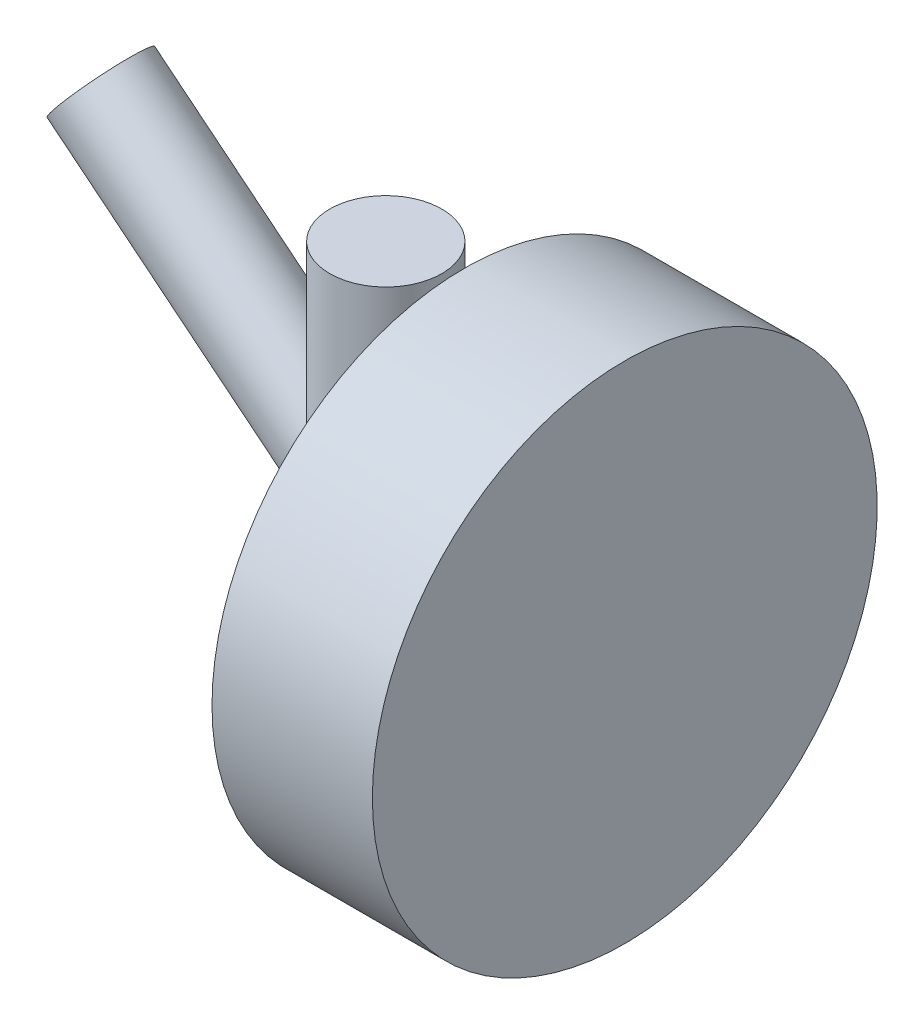
ISO-10303-21;
HEADER;
FILE_DESCRIPTION(('STEP AP214'),'2;1');
FILE_NAME('part.step','',(''),(''),'','','');
FILE_SCHEMA(('AUTOMOTIVE_DESIGN { 1 0 10303 214 1 1 1 1 }'));
ENDSEC;
DATA;
#1=APPLICATION_CONTEXT('core data for automotive mechanical design processes');
#2=APPLICATION_PROTOCOL_DEFINITION('international standard','automotive_design',2000,#1);
#3=PRODUCT_CONTEXT('',#1,'mechanical');
#4=PRODUCT('Part','Part','',(#3));
#5=PRODUCT_RELATED_PRODUCT_CATEGORY('part','',(#4));
#6=PRODUCT_DEFINITION_FORMATION('','',#4);
#7=PRODUCT_DEFINITION_CONTEXT('part definition',#1,'design');
#8=PRODUCT_DEFINITION('design','',#6,#7);
#9=PRODUCT_DEFINITION_SHAPE('','',#8);
#10=(LENGTH_UNIT() NAMED_UNIT(*) SI_UNIT(.MILLI.,.METRE.));
#11=(NAMED_UNIT(*) PLANE_ANGLE_UNIT() SI_UNIT($,.RADIAN.));
#12=(NAMED_UNIT(*) SI_UNIT($,.STERADIAN.) SOLID_ANGLE_UNIT());
#13=UNCERTAINTY_MEASURE_WITH_UNIT(LENGTH_MEASURE(1.E-05),#10,'distance_accuracy_value','');
#14=(GEOMETRIC_REPRESENTATION_CONTEXT(3) GLOBAL_UNCERTAINTY_ASSIGNED_CONTEXT((#13)) GLOBAL_UNIT_ASSIGNED_CONTEXT((#10,
#11,#12)) REPRESENTATION_CONTEXT('',''));
#15=CARTESIAN_POINT('',(0.,0.,0.));
#16=DIRECTION('',(0.,0.,1.));
#17=DIRECTION('',(1.,0.,0.));
#18=AXIS2_PLACEMENT_3D('',#15,#16,#17);
#19=CARTESIAN_POINT('',(-198.0692,294.8051,0.));
#20=DIRECTION('',(0.,-1.,0.));
#21=DIRECTION('',(0.,0.,-1.));
#22=AXIS2_PLACEMENT_3D('',#19,#20,#21);
#23=CYLINDRICAL_SURFACE('',#22,69.85);
#24=CARTESIAN_POINT('',(-267.9192,-15.0097575423861,0.));
#25=CARTESIAN_POINT('',(-267.919199514,-15.0097574246912,-0.788746565234139));
#26=CARTESIAN_POINT('',(-267.905835387529,-14.999470690748,-1.57751228041458));
#27=CARTESIAN_POINT('',(-267.852426487694,-14.9583241642953,-3.15367889710876));
#28=CARTESIAN_POINT('',(-267.812378775792,-14.9274621059217,-3.94107963872814));
#29=CARTESIAN_POINT('',(-267.705729074766,-14.8451510373862,-5.5133922994265));
#30=CARTESIAN_POINT('',(-267.639114087733,-14.7936919501842,-6.29830281042813));
#31=CARTESIAN_POINT('',(-267.479579983196,-14.6701934897539,-7.86389546405467));
#32=CARTESIAN_POINT('',(-267.386658303276,-14.5981521116913,-8.64457718721931));
#33=CARTESIAN_POINT('',(-267.174653411037,-14.4333351711036,-10.2018419788728));
#34=CARTESIAN_POINT('',(-267.055516468837,-14.3405170183819,-10.9784132254908));
#35=CARTESIAN_POINT('',(-266.791644365705,-14.1342366410639,-12.524505517223));
#36=CARTESIAN_POINT('',(-266.646906734118,-14.0207724239392,-13.2940258743285));
#37=CARTESIAN_POINT('',(-266.332436706737,-13.7732426398969,-14.8244057729401));
#38=CARTESIAN_POINT('',(-266.162710556535,-13.6391822203979,-15.5852674275447));
#39=CARTESIAN_POINT('',(-265.798901941647,-13.350438732141,-17.0972194229875));
#40=CARTESIAN_POINT('',(-265.60481713359,-13.1957536791472,-17.8483088160244));
#41=CARTESIAN_POINT('',(-264.988092991904,-12.7015167298689,-20.0814337666092));
#42=CARTESIAN_POINT('',(-264.530184904788,-12.3311598613363,-21.5471916362437));
#43=CARTESIAN_POINT('',(-263.527376391011,-11.5078949122799,-24.4248094406883));
#44=CARTESIAN_POINT('',(-262.982472209132,-11.0549832681287,-25.8366670456121));
#45=CARTESIAN_POINT('',(-262.106550476387,-10.3131158745235,-27.9070406866379));
#46=CARTESIAN_POINT('',(-261.804746456678,-10.0553496819239,-28.5894007535406));
#47=CARTESIAN_POINT('',(-261.182848961041,-9.51876830593788,-29.9372736943933));
#48=CARTESIAN_POINT('',(-260.862757155227,-9.23995504390952,-30.6027880987721));
#49=CARTESIAN_POINT('',(-260.205594575608,-8.66101721224479,-31.9159863658184));
#50=CARTESIAN_POINT('',(-259.868522437827,-8.3608909298055,-32.5636687896164));
#51=CARTESIAN_POINT('',(-259.178913812704,-7.73906882168783,-33.8400871883054));
#52=CARTESIAN_POINT('',(-258.826378719942,-7.41737493978077,-34.4688248632015));
#53=CARTESIAN_POINT('',(-258.100066107774,-6.74523030137226,-35.7190547150709));
#54=CARTESIAN_POINT('',(-257.726001845495,-6.39432653364939,-36.3401369080405));
#55=CARTESIAN_POINT('',(-256.965278817077,-5.66921108512636,-37.560502376154));
#56=CARTESIAN_POINT('',(-256.578621278686,-5.29500167322196,-38.1597877643324));
#57=CARTESIAN_POINT('',(-255.794613253508,-4.52260633292209,-39.3357168886533));
#58=CARTESIAN_POINT('',(-255.397260581292,-4.12441548330091,-39.9123559371604));
#59=CARTESIAN_POINT('',(-254.594158576258,-3.3034893128044,-41.0418288139147));
#60=CARTESIAN_POINT('',(-254.188409300989,-2.88075416011635,-41.5946628052384));
#61=CARTESIAN_POINT('',(-253.371303768851,-2.01039370639043,-42.675029220803));
#62=CARTESIAN_POINT('',(-252.959952611757,-1.56279003282565,-43.202582909279));
#63=CARTESIAN_POINT('',(-252.133986154375,-0.641583056271478,-44.231852939435));
#64=CARTESIAN_POINT('',(-251.719370773641,-0.167979110780758,-44.7335686420296));
#65=CARTESIAN_POINT('',(-250.889997271507,0.8058566927251,-45.7099107453268));
#66=CARTESIAN_POINT('',(-250.475239249304,1.30607926997634,-46.184546469587));
#67=CARTESIAN_POINT('',(-249.648782486552,2.3339955277378,-47.1057556640213));
#68=CARTESIAN_POINT('',(-249.237083467064,2.86168666746346,-47.5523317212523));
#69=CARTESIAN_POINT('',(-248.248034442641,4.17380525781005,-48.5985658912644));
#70=CARTESIAN_POINT('',(-247.674010104449,4.97269193085116,-49.1834032326349));
#71=CARTESIAN_POINT('',(-246.550773391098,6.62868688710946,-50.2909722248744));
#72=CARTESIAN_POINT('',(-246.001556756501,7.4857851117491,-50.8137145626597));
#73=CARTESIAN_POINT('',(-244.941241230925,9.25642937181965,-51.7933813117081));
#74=CARTESIAN_POINT('',(-244.430066429738,10.169855958681,-52.2504385894543));
#75=CARTESIAN_POINT('',(-243.457067275388,12.0524062846014,-53.0978402947648));
#76=CARTESIAN_POINT('',(-242.995242476352,13.021529520323,-53.4881853250893));
#77=CARTESIAN_POINT('',(-242.129813877661,15.016270492569,-54.2033417675951));
#78=CARTESIAN_POINT('',(-241.726564828995,16.0421843865623,-54.5277582638754));
#79=CARTESIAN_POINT('',(-240.990494115422,18.1374469143481,-55.1090321640959));
#80=CARTESIAN_POINT('',(-240.657669669997,19.2067938313219,-55.3658922354093));
#81=CARTESIAN_POINT('',(-240.067269472652,21.3799822650681,-55.8150746439956));
#82=CARTESIAN_POINT('',(-239.809746598199,22.4838474216421,-56.0073516444529));
#83=CARTESIAN_POINT('',(-239.370925857186,24.7153826903985,-56.3317376589907));
#84=CARTESIAN_POINT('',(-239.189639348023,25.8430563232134,-56.463837708387));
#85=CARTESIAN_POINT('',(-238.952207471611,27.7046462017586,-56.635806863314));
#86=CARTESIAN_POINT('',(-238.874501948173,28.4344929927039,-56.6917611020748));
#87=CARTESIAN_POINT('',(-238.747638796694,29.8980250214675,-56.7828615862355));
#88=CARTESIAN_POINT('',(-238.698483348331,30.6317105480436,-56.8180062429161));
#89=CARTESIAN_POINT('',(-238.627036371891,32.1011996765967,-56.8690272814057));
#90=CARTESIAN_POINT('',(-238.604751881657,32.8370037828963,-56.8848986152974));
#91=CARTESIAN_POINT('',(-238.585184704168,34.309123221785,-56.8988366770351));
#92=CARTESIAN_POINT('',(-238.587903395221,35.0454385803199,-56.8969024233436));
#93=CARTESIAN_POINT('',(-238.61644313905,36.5194601661338,-56.8765668582434));
#94=CARTESIAN_POINT('',(-238.642329907281,37.2571643893167,-56.8581187056995));
#95=CARTESIAN_POINT('',(-238.715350259225,38.7309488200768,-56.8059412659477));
#96=CARTESIAN_POINT('',(-238.762483747695,39.4670290349191,-56.7722120472407));
#97=CARTESIAN_POINT('',(-238.876115150909,40.936796496272,-56.6905905783213));
#98=CARTESIAN_POINT('',(-238.942610682558,41.6704840260452,-56.64270007108));
#99=CARTESIAN_POINT('',(-239.093210303634,43.1350789473315,-56.5337216598123));
#100=CARTESIAN_POINT('',(-239.177315481572,43.8659861641393,-56.4726329399536));
#101=CARTESIAN_POINT('',(-239.455645436379,46.0705919858773,-56.2693342541238));
#102=CARTESIAN_POINT('',(-239.674523057743,47.5394814401546,-56.1080549169655));
#103=CARTESIAN_POINT('',(-240.165568043644,50.4627331813835,-55.7405789891846));
#104=CARTESIAN_POINT('',(-240.437747971576,51.9170919583392,-55.5343718077408));
#105=CARTESIAN_POINT('',(-241.025873777475,54.8117793479607,-55.0807109503155));
#106=CARTESIAN_POINT('',(-241.341859502763,56.2520938940758,-54.833219678706));
#107=CARTESIAN_POINT('',(-242.009384708663,59.1170728940301,-54.2997716881446));
#108=CARTESIAN_POINT('',(-242.360921514314,60.5417385164078,-54.0138178626862));
#109=CARTESIAN_POINT('',(-243.094359832419,63.380616976573,-53.4039865721828));
#110=CARTESIAN_POINT('',(-243.476364503043,64.7947749047861,-53.079978347638));
#111=CARTESIAN_POINT('',(-244.264253794524,67.6075710391141,-52.3957231339353));
#112=CARTESIAN_POINT('',(-244.670138694074,69.0062090638781,-52.0354757218145));
#113=CARTESIAN_POINT('',(-245.501078669857,71.7871379402355,-51.2791856706064));
#114=CARTESIAN_POINT('',(-245.926123333592,73.1694371677463,-50.8831623594121));
#115=CARTESIAN_POINT('',(-246.791807539403,75.9181959982383,-50.0548592992713));
#116=CARTESIAN_POINT('',(-247.232447207831,77.2846554727651,-49.6225792565299));
#117=CARTESIAN_POINT('',(-248.202757227589,80.2344136845123,-48.6436231357334));
#118=CARTESIAN_POINT('',(-248.734727056381,81.8146728940722,-48.090047423226));
#119=CARTESIAN_POINT('',(-249.81100677351,84.9514982299962,-46.9300976931778));
#120=CARTESIAN_POINT('',(-250.355316994729,86.5080637153237,-46.3237222501061));
#121=CARTESIAN_POINT('',(-251.452581204716,89.5967424237424,-45.0548701607126));
#122=CARTESIAN_POINT('',(-252.00554183855,91.1288348166793,-44.3923484650292));
#123=CARTESIAN_POINT('',(-253.115743049632,94.1644296012132,-43.0079993688805));
#124=CARTESIAN_POINT('',(-253.672983506516,95.667932792735,-42.2861736307557));
#125=CARTESIAN_POINT('',(-254.786294325714,98.6383914521718,-40.7807295787269));
#126=CARTESIAN_POINT('',(-255.342363668669,100.105436397736,-39.9972874483555));
#127=CARTESIAN_POINT('',(-256.450860956764,103.002331456158,-38.3611935289254));
#128=CARTESIAN_POINT('',(-257.003288510371,104.432177616895,-37.5085344253611));
#129=CARTESIAN_POINT('',(-257.825228790055,106.542458955457,-36.1733566453784));
#130=CARTESIAN_POINT('',(-258.097923247715,107.239711919405,-35.7192346757182));
#131=CARTESIAN_POINT('',(-258.640552061154,108.621948231448,-34.7911321896141));
#132=CARTESIAN_POINT('',(-258.910486558288,109.306932209279,-34.3171526965994));
#133=CARTESIAN_POINT('',(-259.446820961162,110.663200085835,-33.3484119965901));
#134=CARTESIAN_POINT('',(-259.713221695017,111.3344872149,-32.8536557758786));
#135=CARTESIAN_POINT('',(-260.241735343311,112.661975299499,-31.8421725531191));
#136=CARTESIAN_POINT('',(-260.503848561655,113.31817732563,-31.3254471177006));
#137=CARTESIAN_POINT('',(-261.017408614203,114.600058507793,-30.2799851235246));
#138=CARTESIAN_POINT('',(-261.268963787498,115.226089726213,-29.751734205232));
#139=CARTESIAN_POINT('',(-261.766143575671,116.460067135253,-28.6718540137984));
#140=CARTESIAN_POINT('',(-262.011768460287,117.068014148717,-28.1202258071212));
#141=CARTESIAN_POINT('',(-262.496105749646,118.263828469696,-26.9920966910855));
#142=CARTESIAN_POINT('',(-262.734815121837,118.851686987812,-26.4155851378802));
#143=CARTESIAN_POINT('',(-263.203941977819,120.004353439166,-25.2366877724647));
#144=CARTESIAN_POINT('',(-263.434359491597,120.569161455769,-24.6343020538472));
#145=CARTESIAN_POINT('',(-263.884212795226,121.669563236042,-23.4058104937846));
#146=CARTESIAN_POINT('',(-264.103702419393,122.205301695515,-22.7798547933157));
#147=CARTESIAN_POINT('',(-264.53136749163,123.247201747627,-21.5001910799204));
#148=CARTESIAN_POINT('',(-264.739542150266,123.753361276754,-20.8464811362581));
#149=CARTESIAN_POINT('',(-265.343913248172,125.220348127563,-18.843512484544));
#150=CARTESIAN_POINT('',(-265.72070521391,126.131511588153,-17.4504104207073));
#151=CARTESIAN_POINT('',(-266.230947037988,127.362306050073,-15.2820978400671));
#152=CARTESIAN_POINT('',(-266.39117635384,127.748250907666,-14.5502253313065));
#153=CARTESIAN_POINT('',(-266.691842587477,128.471668625714,-13.0588554776835));
#154=CARTESIAN_POINT('',(-266.832282488782,128.809148793023,-12.2993623187747));
#155=CARTESIAN_POINT('',(-267.090701426545,129.429573622474,-10.7548875201075));
#156=CARTESIAN_POINT('',(-267.208687350296,129.712535007453,-9.96991378274313));
#157=CARTESIAN_POINT('',(-267.419667835072,130.218168858637,-8.37735611635424));
#158=CARTESIAN_POINT('',(-267.512661923224,130.440840184086,-7.56977175983004));
#159=CARTESIAN_POINT('',(-267.672000244563,130.822185640833,-5.92937730688328));
#160=CARTESIAN_POINT('',(-267.738102951857,130.980279819654,-5.09640783896226));
#161=CARTESIAN_POINT('',(-267.840576477174,131.225294949851,-3.41819566136495));
#162=CARTESIAN_POINT('',(-267.876947973341,131.312217524591,-2.57295323207194));
#163=CARTESIAN_POINT('',(-267.918829432377,131.412304057278,-0.877689653397954));
#164=CARTESIAN_POINT('',(-267.92435278092,131.425500006792,-0.0276707369410175));
#165=CARTESIAN_POINT('',(-267.904394502681,131.3778084117,1.66988746932806));
#166=CARTESIAN_POINT('',(-267.878914306241,131.316924284763,2.51742687172382));
#167=CARTESIAN_POINT('',(-267.801507360183,131.131887053062,4.12487406874156));
#168=CARTESIAN_POINT('',(-267.752236333972,131.014086703731,4.88565505114856));
#169=CARTESIAN_POINT('',(-267.630033233979,130.72175890286,6.39418483007111));
#170=CARTESIAN_POINT('',(-267.557103246294,130.54723645271,7.14193476945812));
#171=CARTESIAN_POINT('',(-267.389172012045,130.145090917758,8.6207987087367));
#172=CARTESIAN_POINT('',(-267.294160032366,129.917442010228,9.35190442823406));
#173=CARTESIAN_POINT('',(-267.08398505699,129.413423627363,10.7941343318773));
#174=CARTESIAN_POINT('',(-266.968818952103,129.137046634665,11.5052554133056));
#175=CARTESIAN_POINT('',(-266.663335058484,128.403188323564,13.226580075604));
#176=CARTESIAN_POINT('',(-266.462772967447,127.92077664942,14.2243932345247));
#177=CARTESIAN_POINT('',(-266.029162740276,126.875862016461,16.1697394402292));
#178=CARTESIAN_POINT('',(-265.796100512694,126.313324314228,17.1172504295676));
#179=CARTESIAN_POINT('',(-265.302665331289,125.119732727752,18.9630718373461));
#180=CARTESIAN_POINT('',(-265.04223943957,124.488545948657,19.8612815727242));
#181=CARTESIAN_POINT('',(-264.499351825974,123.169488318633,21.6077256515166));
#182=CARTESIAN_POINT('',(-264.21689063339,122.481618829215,22.4559611944657));
#183=CARTESIAN_POINT('',(-263.677901974756,121.165362444887,23.9806661808023));
#184=CARTESIAN_POINT('',(-263.423866238154,120.543596189873,24.6637780027805));
#185=CARTESIAN_POINT('',(-262.904926022324,119.270165056335,25.9973684813582));
#186=CARTESIAN_POINT('',(-262.640019854974,118.618495532115,26.6478420342717));
#187=CARTESIAN_POINT('',(-262.101039939681,117.288843026575,27.918135404953));
#188=CARTESIAN_POINT('',(-261.82696075291,116.610844394712,28.5379364767762));
#189=CARTESIAN_POINT('',(-261.27135617336,115.232177597439,29.7481638738328));
#190=CARTESIAN_POINT('',(-260.989831093106,114.531510383214,30.3385914289627));
#191=CARTESIAN_POINT('',(-260.419945953433,113.108397263924,31.4932134568901));
#192=CARTESIAN_POINT('',(-260.131570362293,112.385900604686,32.0573375578823));
#193=CARTESIAN_POINT('',(-259.549852482297,110.923128574617,33.1593129726793));
#194=CARTESIAN_POINT('',(-259.256510197439,110.182853218103,33.6971643076401));
#195=CARTESIAN_POINT('',(-258.665974588751,108.686660742672,34.7478990120863));
#196=CARTESIAN_POINT('',(-258.368782358929,107.930748032371,35.2607892857031));
#197=CARTESIAN_POINT('',(-257.771368596761,106.404660533779,36.2631211748563));
#198=CARTESIAN_POINT('',(-257.471146887424,105.634484909981,36.7525614106516));
#199=CARTESIAN_POINT('',(-256.875783056736,104.100003292418,37.6976476819405));
#200=CARTESIAN_POINT('',(-256.58069292982,103.33600330183,38.1538239301194));
#201=CARTESIAN_POINT('',(-255.989133266872,101.796823202633,39.046001159039));
#202=CARTESIAN_POINT('',(-255.692663674281,101.021642632834,39.4820013043902));
#203=CARTESIAN_POINT('',(-254.802106026042,98.6805382131018,40.7612637863246));
#204=CARTESIAN_POINT('',(-254.206924556855,97.0991942984466,41.57570089882));
#205=CARTESIAN_POINT('',(-253.018129427955,93.9000174597783,43.1346603701331));
#206=CARTESIAN_POINT('',(-252.424517758081,92.282151755805,43.8791165503786));
#207=CARTESIAN_POINT('',(-251.244154065221,89.0155091142153,45.3023313057379));
#208=CARTESIAN_POINT('',(-250.657401593733,87.3667342162244,45.9810941977094));
#209=CARTESIAN_POINT('',(-249.495525187349,84.0409352252499,47.2769790102923));
#210=CARTESIAN_POINT('',(-248.920402440552,82.3639082777863,47.8940946581171));
#211=CARTESIAN_POINT('',(-247.787127820669,78.983650170291,49.0695069589657));
#212=CARTESIAN_POINT('',(-247.228976694315,77.2804178622058,49.6278010265664));
#213=CARTESIAN_POINT('',(-246.136121063595,73.8501993551882,50.6869996951464));
#214=CARTESIAN_POINT('',(-245.601399674888,72.1232314804983,51.1879460572791));
#215=CARTESIAN_POINT('',(-244.822114674072,69.5146560559766,51.897118185908));
#216=CARTESIAN_POINT('',(-244.566158341259,68.6421312938288,52.1264627040567));
#217=CARTESIAN_POINT('',(-244.06291147913,66.89101415162,52.5710348600175));
#218=CARTESIAN_POINT('',(-243.815620755955,66.0124219078227,52.786262813727));
#219=CARTESIAN_POINT('',(-243.327339106101,64.2362675049545,53.2055298219142));
#220=CARTESIAN_POINT('',(-243.086493299327,63.3386158794026,53.4093590843661));
#221=CARTESIAN_POINT('',(-242.616343271591,61.537074501948,53.8021221186261));
#222=CARTESIAN_POINT('',(-242.387038706453,60.6331849369835,53.9910563347185));
#223=CARTESIAN_POINT('',(-241.941528048423,58.8190485170584,54.3536919826032));
#224=CARTESIAN_POINT('',(-241.725323076128,57.9088011256286,54.5273921117712));
#225=CARTESIAN_POINT('',(-241.307833397327,56.0820179477803,54.859038936268));
#226=CARTESIAN_POINT('',(-241.106548763962,55.1654821305602,55.0169855543747));
#227=CARTESIAN_POINT('',(-240.72111443017,53.3269240037517,55.3163284232419));
#228=CARTESIAN_POINT('',(-240.536950620749,52.4049068900607,55.4577383268788));
#229=CARTESIAN_POINT('',(-240.187903112118,50.5547219038263,55.7232935306459));
#230=CARTESIAN_POINT('',(-240.023019697692,49.6265539406443,55.8474385757662));
#231=CARTESIAN_POINT('',(-239.715221206426,47.7644647682787,56.0773424193223));
#232=CARTESIAN_POINT('',(-239.572301946424,46.8305446899368,56.1831047193306));
#233=CARTESIAN_POINT('',(-239.311420520891,44.9572503982976,56.3748874882439));
#234=CARTESIAN_POINT('',(-239.193456973538,44.0178764899455,56.4609090502367));
#235=CARTESIAN_POINT('',(-238.937724473334,41.6978642263815,56.6464624947154));
#236=CARTESIAN_POINT('',(-238.816092927683,40.3143869453207,56.7337948154914));
#237=CARTESIAN_POINT('',(-238.645337090792,37.5401616929089,56.8560585561043));
#238=CARTESIAN_POINT('',(-238.596215327016,36.1494134698112,56.8909881493466));
#239=CARTESIAN_POINT('',(-238.586703219567,34.0643881955424,56.8977501945348));
#240=CARTESIAN_POINT('',(-238.594189521793,33.370232253709,56.8924259021379));
#241=CARTESIAN_POINT('',(-238.632077375852,31.9828932162044,56.8654214841375));
#242=CARTESIAN_POINT('',(-238.66247635368,31.2897100200179,56.8437431957392));
#243=CARTESIAN_POINT('',(-238.747714810297,29.9057350703658,56.7827764262588));
#244=CARTESIAN_POINT('',(-238.802549201467,29.2149428492395,56.7434916109661));
#245=CARTESIAN_POINT('',(-238.937994180418,27.8372888761608,56.646014938382));
#246=CARTESIAN_POINT('',(-239.018602998068,27.1504268575874,56.5878243794903));
#247=CARTESIAN_POINT('',(-239.259385298037,25.3995543869467,56.412984787275));
#248=CARTESIAN_POINT('',(-239.438842492225,24.3395048379483,56.2818435447712));
#249=CARTESIAN_POINT('',(-239.865495892334,22.2413594735926,55.965725217789));
#250=CARTESIAN_POINT('',(-240.112683606741,21.2032609237564,55.7807548817929));
#251=CARTESIAN_POINT('',(-240.673807561279,19.1580534860018,55.35335627175));
#252=CARTESIAN_POINT('',(-240.987698373815,18.1509240385086,55.110967089509));
#253=CARTESIAN_POINT('',(-241.678099057733,16.1750185487915,54.5662843972896));
#254=CARTESIAN_POINT('',(-242.054611024076,15.2062437910477,54.2639888831092));
#255=CARTESIAN_POINT('',(-242.862258559278,13.315228442018,53.5992269986902));
#256=CARTESIAN_POINT('',(-243.293305952768,12.3929160210554,53.2368574717167));
#257=CARTESIAN_POINT('',(-244.201032377828,10.5976630092311,52.452226789714));
#258=CARTESIAN_POINT('',(-244.677711740843,9.72472277705441,52.0299651996519));
#259=CARTESIAN_POINT('',(-245.667018307276,8.02915448856761,51.1265051723817));
#260=CARTESIAN_POINT('',(-246.179703086294,7.20661114242395,50.6452113764494));
#261=CARTESIAN_POINT('',(-247.229883559862,5.61369254686001,49.6264508635468));
#262=CARTESIAN_POINT('',(-247.767382697751,4.84332457431334,49.0889763375555));
#263=CARTESIAN_POINT('',(-248.67768074601,3.59939345896942,48.146457173881));
#264=CARTESIAN_POINT('',(-249.04643579059,3.11162341373431,47.7560793428982));
#265=CARTESIAN_POINT('',(-249.787925499967,2.15871888711724,46.9520487908118));
#266=CARTESIAN_POINT('',(-250.160660434886,1.69358595421276,46.5383944816568));
#267=CARTESIAN_POINT('',(-250.907594055559,0.785400247691264,45.6885844163769));
#268=CARTESIAN_POINT('',(-251.281793003976,0.342351652539598,45.2524244335999));
#269=CARTESIAN_POINT('',(-252.029301232031,-0.52220417813357,44.3584209490782));
#270=CARTESIAN_POINT('',(-252.402610413419,-0.943709131114277,43.9005751595907));
#271=CARTESIAN_POINT('',(-253.146379200355,-1.76594173239683,42.9637609081959));
#272=CARTESIAN_POINT('',(-253.516837060365,-2.16665740073964,42.4847805551693));
#273=CARTESIAN_POINT('',(-254.252773025736,-2.94765147285345,41.5066650492368));
#274=CARTESIAN_POINT('',(-254.618250660967,-3.32792795702386,41.007528010945));
#275=CARTESIAN_POINT('',(-255.342340951166,-4.06845723871743,39.9899947703196));
#276=CARTESIAN_POINT('',(-255.700954855342,-4.42871370307647,39.4716021240262));
#277=CARTESIAN_POINT('',(-256.409784445543,-5.12978127726254,38.4161794407724));
#278=CARTESIAN_POINT('',(-256.75999939283,-5.47059068021687,37.8791477744937));
#279=CARTESIAN_POINT('',(-257.455762559949,-6.13820044799497,36.7789173695218));
#280=CARTESIAN_POINT('',(-257.801158252038,-6.4647080533846,36.215444531724));
#281=CARTESIAN_POINT('',(-258.480295219845,-7.09848218700589,35.0708564135535));
#282=CARTESIAN_POINT('',(-258.81403550664,-7.40574708430406,34.4897396439341));
#283=CARTESIAN_POINT('',(-259.468480331455,-8.00131355101951,33.3107394557602));
#284=CARTESIAN_POINT('',(-259.789185720647,-8.28961635941459,32.7128571363106));
#285=CARTESIAN_POINT('',(-260.416360267829,-8.84755010331951,31.5011077491464));
#286=CARTESIAN_POINT('',(-260.722828361049,-9.11717964304378,30.8872394912274));
#287=CARTESIAN_POINT('',(-261.619237730629,-9.8984780125827,29.0226841440802));
#288=CARTESIAN_POINT('',(-262.186155668676,-10.3825309467372,27.7490974702022));
#289=CARTESIAN_POINT('',(-263.250168241425,-11.2779894428994,25.1483209218314));
#290=CARTESIAN_POINT('',(-263.74726203997,-11.6893941349473,23.8211304056685));
#291=CARTESIAN_POINT('',(-264.456884196295,-12.2700847855876,21.7326243581973));
#292=CARTESIAN_POINT('',(-264.696322511337,-12.4646344105698,20.987280756198));
#293=CARTESIAN_POINT('',(-265.151295918704,-12.8322443365057,19.4841277548892));
#294=CARTESIAN_POINT('',(-265.366832975555,-13.005306403736,18.7263193859901));
#295=CARTESIAN_POINT('',(-265.773191268376,-13.3300272279388,17.1993184178238));
#296=CARTESIAN_POINT('',(-265.964004796813,-13.4816793116872,16.4301223513287));
#297=CARTESIAN_POINT('',(-266.320051498264,-13.7635152208069,14.8820202134188));
#298=CARTESIAN_POINT('',(-266.485287309847,-13.893701260682,14.1031151525424));
#299=CARTESIAN_POINT('',(-266.78922313993,-14.1323763684799,12.5385291904171));
#300=CARTESIAN_POINT('',(-266.92797642394,-14.2409090092387,11.7528652841877));
#301=CARTESIAN_POINT('',(-267.178792679443,-14.4365859593447,10.174722977193));
#302=CARTESIAN_POINT('',(-267.290858320631,-14.5237324080833,9.38224526626999));
#303=CARTESIAN_POINT('',(-267.487814506025,-14.6765952914735,7.7922925939298));
#304=CARTESIAN_POINT('',(-267.572719271703,-14.7423229413755,6.99482047135787));
#305=CARTESIAN_POINT('',(-267.715084393364,-14.8523897352056,5.39604147098081));
#306=CARTESIAN_POINT('',(-267.772547950492,-14.8967313739186,4.59473505148484));
#307=CARTESIAN_POINT('',(-267.850493307661,-14.9568367359309,3.16118464406946));
#308=CARTESIAN_POINT('',(-267.876252771369,-14.9766817194201,2.52939034549314));
#309=CARTESIAN_POINT('',(-267.910606170683,-15.003142060608,1.26506812841235));
#310=CARTESIAN_POINT('',(-267.91920038975,-15.0097576367722,0.632540222194997));
#311=CARTESIAN_POINT('',(-267.9192,-15.0097575423861,0.));
#312=B_SPLINE_CURVE_WITH_KNOTS('',3,(#24,#25,#26,#27,#28,#29,#30,#31,#32,#33,#34,#35,#36,#37,
#38,#39,#40,#41,#42,#43,#44,#45,#46,#47,#48,#49,#50,#51,#52,#53,#54,#55,#56,#57,#58,#59,#60,#61,
#62,#63,#64,#65,#66,#67,#68,#69,#70,#71,#72,#73,#74,#75,#76,#77,#78,#79,#80,#81,#82,#83,#84,#85,
#86,#87,#88,#89,#90,#91,#92,#93,#94,#95,#96,#97,#98,#99,#100,#101,#102,#103,#104,#105,#106,#107,
#108,#109,#110,#111,#112,#113,#114,#115,#116,#117,#118,#119,#120,#121,#122,#123,#124,#125,#126,
#127,#128,#129,#130,#131,#132,#133,#134,#135,#136,#137,#138,#139,#140,#141,#142,#143,#144,#145,
#146,#147,#148,#149,#150,#151,#152,#153,#154,#155,#156,#157,#158,#159,#160,#161,#162,#163,#164,
#165,#166,#167,#168,#169,#170,#171,#172,#173,#174,#175,#176,#177,#178,#179,#180,#181,#182,#183,
#184,#185,#186,#187,#188,#189,#190,#191,#192,#193,#194,#195,#196,#197,#198,#199,#200,#201,#202,
#203,#204,#205,#206,#207,#208,#209,#210,#211,#212,#213,#214,#215,#216,#217,#218,#219,#220,#221,
#222,#223,#224,#225,#226,#227,#228,#229,#230,#231,#232,#233,#234,#235,#236,#237,#238,#239,#240,
#241,#242,#243,#244,#245,#246,#247,#248,#249,#250,#251,#252,#253,#254,#255,#256,#257,#258,#259,
#260,#261,#262,#263,#264,#265,#266,#267,#268,#269,#270,#271,#272,#273,#274,#275,#276,#277,#278,
#279,#280,#281,#282,#283,#284,#285,#286,#287,#288,#289,#290,#291,#292,#293,#294,#295,#296,#297,
#298,#299,#300,#301,#302,#303,#304,#305,#306,#307,#308,#309,#310,#311),.UNSPECIFIED.,.T.,.F.,(4,
2,2,2,2,2,2,2,2,2,2,2,2,2,2,2,2,2,2,2,2,2,2,2,2,2,2,2,2,2,2,2,2,2,2,2,2,2,2,2,2,2,2,2,2,2,2,2,2,
2,2,2,2,2,2,2,2,2,2,2,2,2,2,2,2,2,2,2,2,2,2,2,2,2,2,2,2,2,2,2,2,2,2,2,2,2,2,2,2,2,2,2,2,2,2,2,2,
2,2,2,2,2,2,2,2,2,2,2,2,2,2,2,2,2,2,2,2,2,2,2,2,2,2,2,2,2,2,2,2,2,2,2,2,2,2,2,2,2,2,2,2,2,2,4),
(0.,2.3660927396008,4.73244608896001,7.09995858812114,9.46770177537465,11.840343772407,
14.2132148720168,16.5854939036826,18.9580013303073,23.6910661803368,28.4243353901489,
30.7919598198332,33.1593683730977,35.5269673969325,37.8943533279417,40.3100713675603,
42.7255545940812,45.1415352016027,47.5574992558216,49.9713941362625,52.3853486941334,
54.7984670558296,57.2113626043894,60.6413492603182,64.0707447373793,67.4931025988087,
70.9154295368282,74.3576884978661,77.7998115256037,81.2443458714583,84.689393189008,
86.8969015417715,89.1045784062768,91.3128333635339,93.5212100521209,95.7358706475639,
97.950521315363,100.164899517368,102.379414637777,106.858699267857,111.339040942365,
115.823485169158,120.307592224865,124.807584670595,129.307629643728,133.805257847456,
138.302922499803,143.572593537633,148.842406894545,154.116489300291,159.390423919622,
164.649791459566,169.909715508637,172.536387500661,175.162924283798,177.78883427743,
180.414557329885,182.984710507199,185.554746560979,188.1258930585,190.697030256376,
193.253902774993,195.81095345593,200.916648203038,203.4433371624,205.96964478084,
208.495176253547,211.020755508848,213.568542513668,216.116271404037,218.662894694211,
221.209400500952,223.52105730434,225.832510335922,228.145089224647,230.458025191516,
233.831614420217,237.206670948219,240.588381485544,243.970010818281,246.842880184027,
249.716197392732,252.591249517083,255.466181158851,258.34840829878,261.230633117776,
264.112056140325,266.993648490879,269.805781968508,272.618031778276,278.243059397841,
283.873353998913,289.503278368755,295.133775017528,300.764519044021,306.391136268689,
309.204310979004,312.017422715189,314.871695376613,317.72588286956,320.580314178663,
323.434759479198,326.286831229759,329.138945102251,331.990515103088,334.84192716816,
339.014167213777,343.186552687198,345.268728847556,347.350671131413,349.432180143046,
351.513546231983,354.759223892873,358.004494822607,361.247562630245,364.490738954962,
367.72873701824,370.966758602289,374.210081427914,377.453855670621,379.629556923267,
381.805406794813,383.981666797254,386.158156897684,388.335887592189,390.513822457985,
392.691357092856,394.86908255735,397.080006029783,399.291116638176,401.502082629373,
403.713213707419,408.135666639123,412.558172525936,414.977548265478,417.396725000543,
419.816654105853,422.236333407366,424.651093390842,427.065611712587,429.478863712032,
431.891834125455,433.789368275115,435.686871089339),.UNSPECIFIED.);
#313=CARTESIAN_POINT('',(-267.9192,-15.0097575423861,0.));
#314=VERTEX_POINT('',#313);
#315=EDGE_CURVE('E55',#314,#314,#312,.T.);
#316=ORIENTED_EDGE('',*,*,#315,.T.);
#317=EDGE_LOOP('',(#316));
#318=FACE_BOUND('',#317,.T.);
#319=CARTESIAN_POINT('',(-198.0692,294.8051,0.));
#320=DIRECTION('',(0.,1.,0.));
#321=DIRECTION('',(0.,0.,1.));
#322=AXIS2_PLACEMENT_3D('',#319,#320,#321);
#323=CIRCLE('',#322,69.85);
#324=CARTESIAN_POINT('',(-198.0692,294.8051,69.85));
#325=VERTEX_POINT('',#324);
#326=EDGE_CURVE('E11',#325,#325,#323,.T.);
#327=ORIENTED_EDGE('',*,*,#326,.F.);
#328=EDGE_LOOP('',(#327));
#329=FACE_BOUND('',#328,.T.);
#330=CARTESIAN_POINT('',(-198.0692,-162.3949,0.));
#331=DIRECTION('',(0.,1.,0.));
#332=DIRECTION('',(0.,0.,1.));
#333=AXIS2_PLACEMENT_3D('',#330,#331,#332);
#334=CIRCLE('',#333,69.85);
#335=CARTESIAN_POINT('',(-198.0692,-162.3949,69.85));
#336=VERTEX_POINT('',#335);
#337=EDGE_CURVE('E64',#336,#336,#334,.T.);
#338=ORIENTED_EDGE('',*,*,#337,.T.);
#339=EDGE_LOOP('',(#338));
#340=FACE_BOUND('',#339,.T.);
#341=ADVANCED_FACE('F51',(#318,#329,#340),#23,.T.);
#342=CARTESIAN_POINT('',(-198.0692,294.8051,0.));
#343=DIRECTION('',(0.,1.,0.));
#344=DIRECTION('',(0.,0.,1.));
#345=AXIS2_PLACEMENT_3D('',#342,#343,#344);
#346=PLANE('',#345);
#347=ORIENTED_EDGE('',*,*,#326,.T.);
#348=EDGE_LOOP('',(#347));
#349=FACE_BOUND('',#348,.T.);
#350=ADVANCED_FACE('F90',(#349),#346,.T.);
#351=CARTESIAN_POINT('',(-198.0692,-162.3949,0.));
#352=DIRECTION('',(0.,1.,0.));
#353=DIRECTION('',(0.,0.,1.));
#354=AXIS2_PLACEMENT_3D('',#351,#352,#353);
#355=PLANE('',#354);
#356=ORIENTED_EDGE('',*,*,#337,.F.);
#357=EDGE_LOOP('',(#356));
#358=FACE_BOUND('',#357,.T.);
#359=ADVANCED_FACE('F82',(#358),#355,.F.);
#360=CARTESIAN_POINT('',(-198.0692,1.6383000000002,0.));
#361=DIRECTION('',(-0.777145961456968,0.629320391049841,0.));
#362=DIRECTION('',(-0.629320391049841,-0.777145961456968,0.));
#363=AXIS2_PLACEMENT_3D('',#360,#361,#362);
#364=CYLINDRICAL_SURFACE('',#363,56.896);
#365=CARTESIAN_POINT('',(-553.380333578126,289.363582787987,0.));
#366=DIRECTION('',(-0.777145961456968,0.629320391049841,0.));
#367=DIRECTION('',(-0.629320391049841,-0.777145961456968,0.));
#368=AXIS2_PLACEMENT_3D('',#365,#366,#367);
#369=CIRCLE('',#368,56.896);
#370=CARTESIAN_POINT('',(-589.186146547297,245.147086164932,0.));
#371=VERTEX_POINT('',#370);
#372=EDGE_CURVE('E70',#371,#371,#369,.T.);
#373=ORIENTED_EDGE('',*,*,#372,.F.);
#374=EDGE_LOOP('',(#373));
#375=FACE_BOUND('',#374,.T.);
#376=ORIENTED_EDGE('',*,*,#315,.F.);
#377=EDGE_LOOP('',(#376));
#378=FACE_BOUND('',#377,.T.);
#379=ADVANCED_FACE('F79',(#375,#378),#364,.T.);
#380=CARTESIAN_POINT('',(-553.380333578126,289.363582787987,0.));
#381=DIRECTION('',(-0.777145961456968,0.629320391049841,0.));
#382=DIRECTION('',(-0.629320391049841,-0.777145961456968,0.));
#383=AXIS2_PLACEMENT_3D('',#380,#381,#382);
#384=PLANE('',#383);
#385=ORIENTED_EDGE('',*,*,#372,.T.);
#386=EDGE_LOOP('',(#385));
#387=FACE_BOUND('',#386,.T.);
#388=ADVANCED_FACE('F81',(#387),#384,.T.);
#389=CLOSED_SHELL('',(#341,#350,#359,#379,#388));
#390=MANIFOLD_SOLID_BREP('B2',#389);
#391=CARTESIAN_POINT('',(99.9998,0.,0.));
#392=DIRECTION('',(-1.,0.,0.));
#393=DIRECTION('',(0.,0.,1.));
#394=AXIS2_PLACEMENT_3D('',#391,#392,#393);
#395=CYLINDRICAL_SURFACE('',#394,314.7949);
#396=CARTESIAN_POINT('',(99.9998,0.,0.));
#397=DIRECTION('',(1.,0.,0.));
#398=DIRECTION('',(0.,0.,-1.));
#399=AXIS2_PLACEMENT_3D('',#396,#397,#398);
#400=CIRCLE('',#399,314.7949);
#401=CARTESIAN_POINT('',(99.9998,0.,314.7949));
#402=VERTEX_POINT('',#401);
#403=EDGE_CURVE('E50',#402,#402,#400,.T.);
#404=CARTESIAN_POINT('',(-99.9998,0.,0.));
#405=DIRECTION('',(1.,0.,0.));
#406=DIRECTION('',(0.,0.,-1.));
#407=AXIS2_PLACEMENT_3D('',#404,#405,#406);
#408=CIRCLE('',#407,314.7949);
#409=CARTESIAN_POINT('',(-99.9998,0.,314.7949));
#410=VERTEX_POINT('',#409);
#411=EDGE_CURVE('E131',#410,#410,#408,.T.);
#412=CARTESIAN_POINT('',(99.9998,0.,314.7949));
#413=CARTESIAN_POINT('',(97.9164708333333,0.,314.7949));
#414=CARTESIAN_POINT('',(95.8331416666667,0.,314.7949));
#415=CARTESIAN_POINT('',(91.6664833333333,0.,314.7949));
#416=CARTESIAN_POINT('',(89.5831541666666,0.,314.7949));
#417=CARTESIAN_POINT('',(85.4164958333333,0.,314.7949));
#418=CARTESIAN_POINT('',(83.3331666666667,0.,314.7949));
#419=CARTESIAN_POINT('',(79.1665083333333,0.,314.7949));
#420=CARTESIAN_POINT('',(77.0831791666667,0.,314.7949));
#421=CARTESIAN_POINT('',(72.9165208333333,0.,314.7949));
#422=CARTESIAN_POINT('',(70.8331916666667,0.,314.7949));
#423=CARTESIAN_POINT('',(66.6665333333333,0.,314.7949));
#424=CARTESIAN_POINT('',(64.5832041666667,0.,314.7949));
#425=CARTESIAN_POINT('',(60.4165458333333,0.,314.7949));
#426=CARTESIAN_POINT('',(58.3332166666667,0.,314.7949));
#427=CARTESIAN_POINT('',(54.1665583333333,0.,314.7949));
#428=CARTESIAN_POINT('',(52.0832291666667,0.,314.7949));
#429=CARTESIAN_POINT('',(47.9165708333333,0.,314.7949));
#430=CARTESIAN_POINT('',(45.8332416666667,0.,314.7949));
#431=CARTESIAN_POINT('',(41.6665833333333,0.,314.7949));
#432=CARTESIAN_POINT('',(39.5832541666666,0.,314.7949));
#433=CARTESIAN_POINT('',(35.4165958333333,0.,314.7949));
#434=CARTESIAN_POINT('',(33.3332666666667,0.,314.7949));
#435=CARTESIAN_POINT('',(29.1666083333333,0.,314.7949));
#436=CARTESIAN_POINT('',(27.0832791666667,0.,314.7949));
#437=CARTESIAN_POINT('',(22.9166208333333,0.,314.7949));
#438=CARTESIAN_POINT('',(20.8332916666667,0.,314.7949));
#439=CARTESIAN_POINT('',(16.6666333333333,0.,314.7949));
#440=CARTESIAN_POINT('',(14.5833041666667,0.,314.7949));
#441=CARTESIAN_POINT('',(10.4166458333333,0.,314.7949));
#442=CARTESIAN_POINT('',(8.33331666666665,0.,314.7949));
#443=CARTESIAN_POINT('',(4.16665833333332,0.,314.7949));
#444=CARTESIAN_POINT('',(2.08332916666665,0.,314.7949));
#445=CARTESIAN_POINT('',(-2.08332916666668,0.,314.7949));
#446=CARTESIAN_POINT('',(-4.16665833333335,0.,314.7949));
#447=CARTESIAN_POINT('',(-8.33331666666668,0.,314.7949));
#448=CARTESIAN_POINT('',(-10.4166458333333,0.,314.7949));
#449=CARTESIAN_POINT('',(-14.5833041666667,0.,314.7949));
#450=CARTESIAN_POINT('',(-16.6666333333334,0.,314.7949));
#451=CARTESIAN_POINT('',(-20.8332916666667,0.,314.7949));
#452=CARTESIAN_POINT('',(-22.9166208333334,0.,314.7949));
#453=CARTESIAN_POINT('',(-27.0832791666667,0.,314.7949));
#454=CARTESIAN_POINT('',(-29.1666083333334,0.,314.7949));
#455=CARTESIAN_POINT('',(-33.3332666666667,0.,314.7949));
#456=CARTESIAN_POINT('',(-35.4165958333333,0.,314.7949));
#457=CARTESIAN_POINT('',(-39.5832541666667,0.,314.7949));
#458=CARTESIAN_POINT('',(-41.6665833333333,0.,314.7949));
#459=CARTESIAN_POINT('',(-45.8332416666667,0.,314.7949));
#460=CARTESIAN_POINT('',(-47.9165708333333,0.,314.7949));
#461=CARTESIAN_POINT('',(-52.0832291666667,0.,314.7949));
#462=CARTESIAN_POINT('',(-54.1665583333333,0.,314.7949));
#463=CARTESIAN_POINT('',(-58.3332166666667,0.,314.7949));
#464=CARTESIAN_POINT('',(-60.4165458333333,0.,314.7949));
#465=CARTESIAN_POINT('',(-64.5832041666667,0.,314.7949));
#466=CARTESIAN_POINT('',(-66.6665333333333,0.,314.7949));
#467=CARTESIAN_POINT('',(-70.8331916666667,0.,314.7949));
#468=CARTESIAN_POINT('',(-72.9165208333334,0.,314.7949));
#469=CARTESIAN_POINT('',(-77.0831791666667,0.,314.7949));
#470=CARTESIAN_POINT('',(-79.1665083333334,0.,314.7949));
#471=CARTESIAN_POINT('',(-83.3331666666667,0.,314.7949));
#472=CARTESIAN_POINT('',(-85.4164958333334,0.,314.7949));
#473=CARTESIAN_POINT('',(-89.5831541666667,0.,314.7949));
#474=CARTESIAN_POINT('',(-91.6664833333334,0.,314.7949));
#475=CARTESIAN_POINT('',(-95.8331416666667,0.,314.7949));
#476=CARTESIAN_POINT('',(-97.9164708333334,0.,314.7949));
#477=CARTESIAN_POINT('',(-99.9998,0.,314.7949));
#478=B_SPLINE_CURVE_WITH_KNOTS('',3,(#412,#413,#414,#415,#416,#417,#418,#419,#420,#421,#422,
#423,#424,#425,#426,#427,#428,#429,#430,#431,#432,#433,#434,#435,#436,#437,#438,#439,#440,#441,
#442,#443,#444,#445,#446,#447,#448,#449,#450,#451,#452,#453,#454,#455,#456,#457,#458,#459,#460,
#461,#462,#463,#464,#465,#466,#467,#468,#469,#470,#471,#472,#473,#474,#475,#476,#477),
.UNSPECIFIED.,.F.,.F.,(4,2,2,2,2,2,2,2,2,2,2,2,2,2,2,2,2,2,2,2,2,2,2,2,2,2,2,2,2,2,2,2,4),(0.,
6.24998750000001,12.499975,18.7499625,24.99995,31.2499375,37.499925,43.7499125,49.9999,
56.2498875,62.499875,68.7498625,74.99985,81.2498375,87.499825,93.7498125,99.9998,106.2497875,
112.499775,118.7497625,124.99975,131.2497375,137.499725,143.7497125,149.9997,156.2496875,
162.499675,168.7496625,174.99965,181.2496375,187.499625,193.7496125,199.9996),.UNSPECIFIED.);
#479=EDGE_CURVE('BSEAM128',#402,#410,#478,.T.);
#480=ORIENTED_EDGE('',*,*,#403,.F.);
#481=ORIENTED_EDGE('',*,*,#411,.T.);
#482=ORIENTED_EDGE('',*,*,#479,.T.);
#483=ORIENTED_EDGE('',*,*,#479,.F.);
#484=EDGE_LOOP('',(#480,#482,#481,#483));
#485=FACE_BOUND('',#484,.T.);
#486=ADVANCED_FACE('F128',(#485),#395,.T.);
#487=CARTESIAN_POINT('',(99.9998,0.,0.));
#488=DIRECTION('',(1.,0.,0.));
#489=DIRECTION('',(0.,0.,-1.));
#490=AXIS2_PLACEMENT_3D('',#487,#488,#489);
#491=PLANE('',#490);
#492=ORIENTED_EDGE('',*,*,#403,.T.);
#493=EDGE_LOOP('',(#492));
#494=FACE_BOUND('',#493,.T.);
#495=ADVANCED_FACE('F145',(#494),#491,.T.);
#496=CARTESIAN_POINT('',(-99.9998,0.,0.));
#497=DIRECTION('',(1.,0.,0.));
#498=DIRECTION('',(0.,0.,-1.));
#499=AXIS2_PLACEMENT_3D('',#496,#497,#498);
#500=PLANE('',#499);
#501=ORIENTED_EDGE('',*,*,#411,.F.);
#502=EDGE_LOOP('',(#501));
#503=FACE_BOUND('',#502,.T.);
#504=ADVANCED_FACE('F143',(#503),#500,.F.);
#505=CLOSED_SHELL('',(#486,#495,#504));
#506=MANIFOLD_SOLID_BREP('B6',#505);
#507=ADVANCED_BREP_SHAPE_REPRESENTATION('',(#18,#390,#506),#14);
#508=SHAPE_DEFINITION_REPRESENTATION(#9,#507);
ENDSEC;
END-ISO-10303-21;
